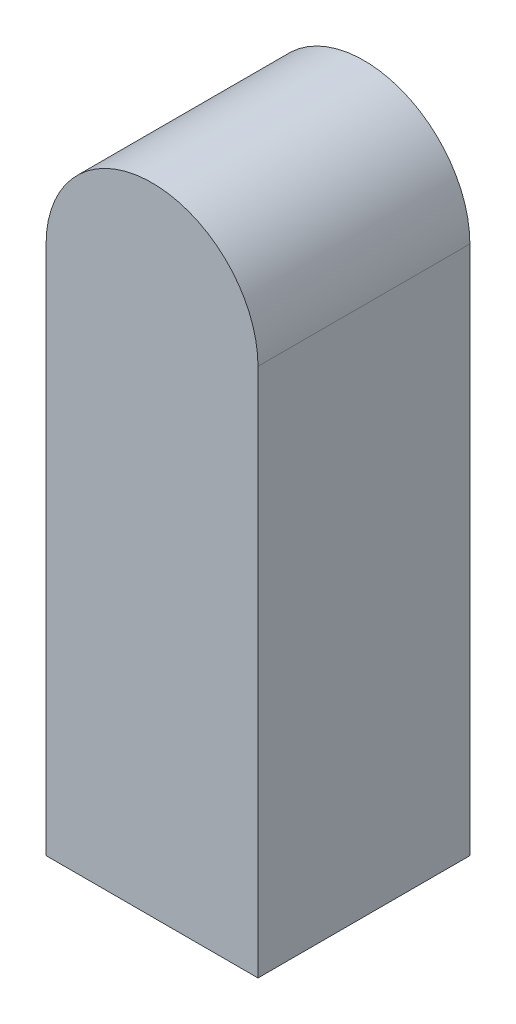
ISO-10303-21;
HEADER;
FILE_DESCRIPTION(('STEP AP214'),'2;1');
FILE_NAME('part.step','',(''),(''),'','','');
FILE_SCHEMA(('AUTOMOTIVE_DESIGN { 1 0 10303 214 1 1 1 1 }'));
ENDSEC;
DATA;
#1=APPLICATION_CONTEXT('core data for automotive mechanical design processes');
#2=APPLICATION_PROTOCOL_DEFINITION('international standard','automotive_design',2000,#1);
#3=PRODUCT_CONTEXT('',#1,'mechanical');
#4=PRODUCT('Part','Part','',(#3));
#5=PRODUCT_RELATED_PRODUCT_CATEGORY('part','',(#4));
#6=PRODUCT_DEFINITION_FORMATION('','',#4);
#7=PRODUCT_DEFINITION_CONTEXT('part definition',#1,'design');
#8=PRODUCT_DEFINITION('design','',#6,#7);
#9=PRODUCT_DEFINITION_SHAPE('','',#8);
#10=(LENGTH_UNIT() NAMED_UNIT(*) SI_UNIT(.MILLI.,.METRE.));
#11=(NAMED_UNIT(*) PLANE_ANGLE_UNIT() SI_UNIT($,.RADIAN.));
#12=(NAMED_UNIT(*) SI_UNIT($,.STERADIAN.) SOLID_ANGLE_UNIT());
#13=UNCERTAINTY_MEASURE_WITH_UNIT(LENGTH_MEASURE(1.E-05),#10,'distance_accuracy_value','');
#14=(GEOMETRIC_REPRESENTATION_CONTEXT(3) GLOBAL_UNCERTAINTY_ASSIGNED_CONTEXT((#13)) GLOBAL_UNIT_ASSIGNED_CONTEXT((#10,
#11,#12)) REPRESENTATION_CONTEXT('',''));
#15=CARTESIAN_POINT('',(0.,0.,0.));
#16=DIRECTION('',(0.,0.,1.));
#17=DIRECTION('',(1.,0.,0.));
#18=AXIS2_PLACEMENT_3D('',#15,#16,#17);
#19=CARTESIAN_POINT('',(0.899999999999997,-1.69999999366701,0.));
#20=DIRECTION('',(0.,0.,1.));
#21=DIRECTION('',(1.,0.,0.));
#22=AXIS2_PLACEMENT_3D('',#19,#20,#21);
#23=PLANE('',#22);
#24=DIRECTION('',(0.,1.,0.));
#25=VECTOR('',#24,1.);
#26=CARTESIAN_POINT('',(0.999999999627469,-1.69999999366701,0.));
#27=LINE('',#26,#25);
#28=CARTESIAN_POINT('',(0.999999999627469,-1.99999999254942,0.));
#29=VERTEX_POINT('',#28);
#30=CARTESIAN_POINT('',(0.999999999999997,-1.49999999478459,0.));
#31=VERTEX_POINT('',#30);
#32=EDGE_CURVE('E51',#29,#31,#27,.T.);
#33=ORIENTED_EDGE('',*,*,#32,.F.);
#34=DIRECTION('',(1.,0.,0.));
#35=VECTOR('',#34,1.);
#36=CARTESIAN_POINT('',(0.899999999999997,-1.99999999254942,0.));
#37=LINE('',#36,#35);
#38=CARTESIAN_POINT('',(0.800000000372527,-1.99999999254942,0.));
#39=VERTEX_POINT('',#38);
#40=EDGE_CURVE('E58',#39,#29,#37,.T.);
#41=ORIENTED_EDGE('',*,*,#40,.F.);
#42=DIRECTION('',(0.,1.,0.));
#43=VECTOR('',#42,1.);
#44=CARTESIAN_POINT('',(0.800000000372527,-1.69999999366701,0.));
#45=LINE('',#44,#43);
#46=CARTESIAN_POINT('',(0.800000000372527,-1.49999999478459,0.));
#47=VERTEX_POINT('',#46);
#48=EDGE_CURVE('E70',#47,#39,#45,.F.);
#49=ORIENTED_EDGE('',*,*,#48,.F.);
#50=CARTESIAN_POINT('',(0.900000000372526,-1.49999999478459,0.));
#51=DIRECTION('',(0.,0.,1.));
#52=DIRECTION('',(1.,0.,0.));
#53=AXIS2_PLACEMENT_3D('',#50,#51,#52);
#54=CIRCLE('',#53,0.0999999999999988);
#55=EDGE_CURVE('E20',#31,#47,#54,.T.);
#56=ORIENTED_EDGE('',*,*,#55,.F.);
#57=EDGE_LOOP('',(#33,#41,#49,#56));
#58=FACE_BOUND('',#57,.T.);
#59=ADVANCED_FACE('F17',(#58),#23,.F.);
#60=CARTESIAN_POINT('',(0.800000000372527,-1.69999999366701,0.));
#61=DIRECTION('',(-1.,0.,0.));
#62=DIRECTION('',(0.,0.,1.));
#63=AXIS2_PLACEMENT_3D('',#60,#61,#62);
#64=PLANE('',#63);
#65=DIRECTION('',(0.,0.,-1.));
#66=VECTOR('',#65,1.);
#67=CARTESIAN_POINT('',(0.800000000372527,-1.99999999254942,0.));
#68=LINE('',#67,#66);
#69=CARTESIAN_POINT('',(0.800000000372527,-1.99999999254942,0.2));
#70=VERTEX_POINT('',#69);
#71=EDGE_CURVE('E63',#70,#39,#68,.T.);
#72=ORIENTED_EDGE('',*,*,#71,.F.);
#73=DIRECTION('',(0.,1.,0.));
#74=VECTOR('',#73,1.);
#75=CARTESIAN_POINT('',(0.800000000372527,-1.69999999366701,0.2));
#76=LINE('',#75,#74);
#77=CARTESIAN_POINT('',(0.800000000372527,-1.49999999478459,0.2));
#78=VERTEX_POINT('',#77);
#79=EDGE_CURVE('E68',#78,#70,#76,.F.);
#80=ORIENTED_EDGE('',*,*,#79,.F.);
#81=DIRECTION('',(0.,0.,1.));
#82=VECTOR('',#81,1.);
#83=CARTESIAN_POINT('',(0.800000000372527,-1.49999999478459,0.));
#84=LINE('',#83,#82);
#85=EDGE_CURVE('E94',#78,#47,#84,.F.);
#86=ORIENTED_EDGE('',*,*,#85,.T.);
#87=ORIENTED_EDGE('',*,*,#48,.T.);
#88=EDGE_LOOP('',(#72,#80,#86,#87));
#89=FACE_BOUND('',#88,.T.);
#90=ADVANCED_FACE('F65',(#89),#64,.T.);
#91=CARTESIAN_POINT('',(0.899999999999997,-1.99999999254942,0.));
#92=DIRECTION('',(0.,-1.,0.));
#93=DIRECTION('',(0.,0.,-1.));
#94=AXIS2_PLACEMENT_3D('',#91,#92,#93);
#95=PLANE('',#94);
#96=ORIENTED_EDGE('',*,*,#40,.T.);
#97=DIRECTION('',(0.,0.,-1.));
#98=VECTOR('',#97,1.);
#99=CARTESIAN_POINT('',(0.999999999627469,-1.99999999254942,0.));
#100=LINE('',#99,#98);
#101=CARTESIAN_POINT('',(0.999999999627469,-1.99999999254942,0.2));
#102=VERTEX_POINT('',#101);
#103=EDGE_CURVE('E74',#102,#29,#100,.T.);
#104=ORIENTED_EDGE('',*,*,#103,.F.);
#105=DIRECTION('',(1.,0.,0.));
#106=VECTOR('',#105,1.);
#107=CARTESIAN_POINT('',(0.899999999999997,-1.99999999254942,0.2));
#108=LINE('',#107,#106);
#109=EDGE_CURVE('E26',#70,#102,#108,.T.);
#110=ORIENTED_EDGE('',*,*,#109,.F.);
#111=ORIENTED_EDGE('',*,*,#71,.T.);
#112=EDGE_LOOP('',(#96,#104,#110,#111));
#113=FACE_BOUND('',#112,.T.);
#114=ADVANCED_FACE('F73',(#113),#95,.T.);
#115=CARTESIAN_POINT('',(0.999999999627469,-1.69999999366701,0.));
#116=DIRECTION('',(1.,0.,0.));
#117=DIRECTION('',(0.,0.,-1.));
#118=AXIS2_PLACEMENT_3D('',#115,#116,#117);
#119=PLANE('',#118);
#120=ORIENTED_EDGE('',*,*,#103,.T.);
#121=ORIENTED_EDGE('',*,*,#32,.T.);
#122=DIRECTION('',(0.,0.,1.));
#123=VECTOR('',#122,1.);
#124=CARTESIAN_POINT('',(1.00000000037252,-1.49999999478459,0.));
#125=LINE('',#124,#123);
#126=CARTESIAN_POINT('',(0.999999999999997,-1.49999999478459,0.2));
#127=VERTEX_POINT('',#126);
#128=EDGE_CURVE('E85',#127,#31,#125,.F.);
#129=ORIENTED_EDGE('',*,*,#128,.F.);
#130=DIRECTION('',(0.,1.,0.));
#131=VECTOR('',#130,1.);
#132=CARTESIAN_POINT('',(0.999999999627469,-1.69999999366701,0.2));
#133=LINE('',#132,#131);
#134=EDGE_CURVE('E11',#102,#127,#133,.T.);
#135=ORIENTED_EDGE('',*,*,#134,.F.);
#136=EDGE_LOOP('',(#120,#121,#129,#135));
#137=FACE_BOUND('',#136,.T.);
#138=ADVANCED_FACE('F107',(#137),#119,.T.);
#139=CARTESIAN_POINT('',(0.900000000372526,-1.49999999478459,0.));
#140=DIRECTION('',(0.,0.,1.));
#141=DIRECTION('',(1.,0.,0.));
#142=AXIS2_PLACEMENT_3D('',#139,#140,#141);
#143=CYLINDRICAL_SURFACE('',#142,0.0999999999999988);
#144=ORIENTED_EDGE('',*,*,#128,.T.);
#145=ORIENTED_EDGE('',*,*,#55,.T.);
#146=ORIENTED_EDGE('',*,*,#85,.F.);
#147=CARTESIAN_POINT('',(0.900000000372526,-1.49999999478459,0.2));
#148=DIRECTION('',(0.,0.,1.));
#149=DIRECTION('',(1.,0.,0.));
#150=AXIS2_PLACEMENT_3D('',#147,#148,#149);
#151=CIRCLE('',#150,0.0999999999999988);
#152=EDGE_CURVE('E35',#127,#78,#151,.T.);
#153=ORIENTED_EDGE('',*,*,#152,.F.);
#154=EDGE_LOOP('',(#144,#145,#146,#153));
#155=FACE_BOUND('',#154,.T.);
#156=ADVANCED_FACE('F105',(#155),#143,.T.);
#157=CARTESIAN_POINT('',(0.899999999999997,-1.69999999366701,0.2));
#158=DIRECTION('',(0.,0.,1.));
#159=DIRECTION('',(1.,0.,0.));
#160=AXIS2_PLACEMENT_3D('',#157,#158,#159);
#161=PLANE('',#160);
#162=ORIENTED_EDGE('',*,*,#134,.T.);
#163=ORIENTED_EDGE('',*,*,#152,.T.);
#164=ORIENTED_EDGE('',*,*,#79,.T.);
#165=ORIENTED_EDGE('',*,*,#109,.T.);
#166=EDGE_LOOP('',(#162,#163,#164,#165));
#167=FACE_BOUND('',#166,.T.);
#168=ADVANCED_FACE('F78',(#167),#161,.T.);
#169=CLOSED_SHELL('',(#59,#90,#114,#138,#156,#168));
#170=MANIFOLD_SOLID_BREP('B1',#169);
#171=ADVANCED_BREP_SHAPE_REPRESENTATION('',(#18,#170),#14);
#172=SHAPE_DEFINITION_REPRESENTATION(#9,#171);
ENDSEC;
END-ISO-10303-21;
